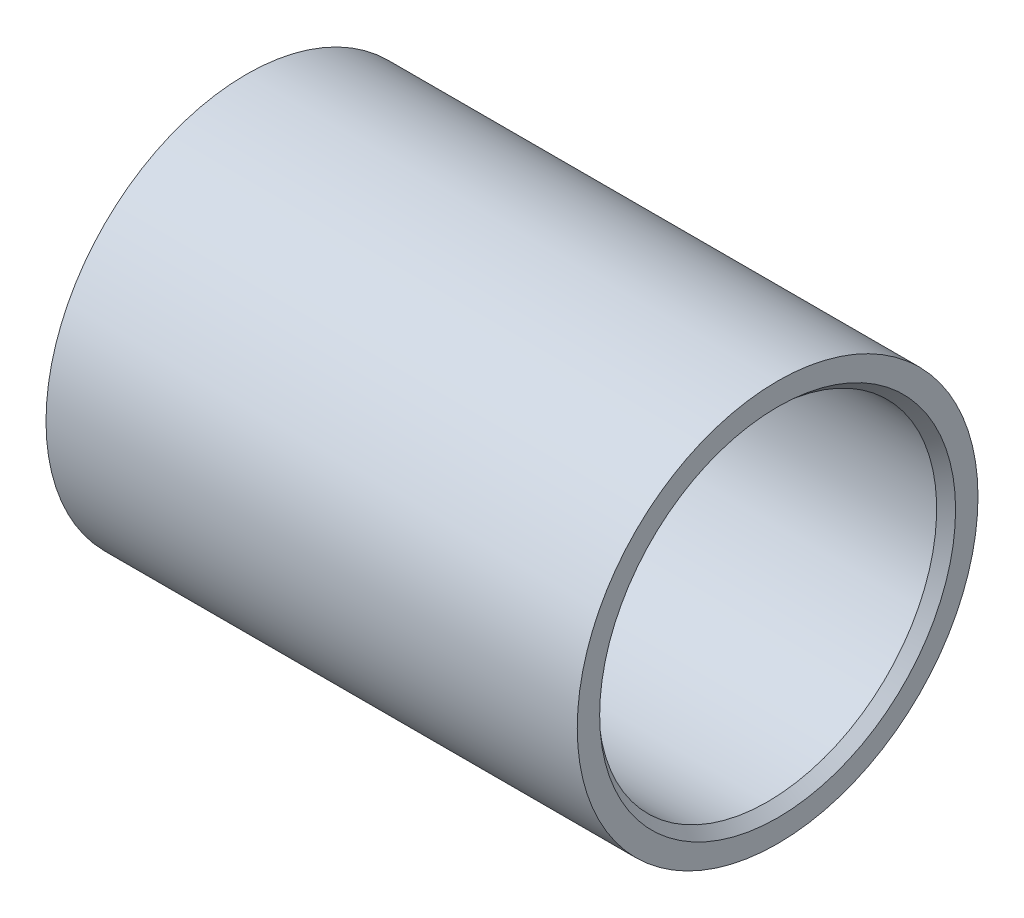
ISO-10303-21;
HEADER;
FILE_DESCRIPTION(('STEP AP214'),'2;1');
FILE_NAME('part.step','',(''),(''),'','','');
FILE_SCHEMA(('AUTOMOTIVE_DESIGN { 1 0 10303 214 1 1 1 1 }'));
ENDSEC;
DATA;
#1=APPLICATION_CONTEXT('core data for automotive mechanical design processes');
#2=APPLICATION_PROTOCOL_DEFINITION('international standard','automotive_design',2000,#1);
#3=PRODUCT_CONTEXT('',#1,'mechanical');
#4=PRODUCT('Part','Part','',(#3));
#5=PRODUCT_RELATED_PRODUCT_CATEGORY('part','',(#4));
#6=PRODUCT_DEFINITION_FORMATION('','',#4);
#7=PRODUCT_DEFINITION_CONTEXT('part definition',#1,'design');
#8=PRODUCT_DEFINITION('design','',#6,#7);
#9=PRODUCT_DEFINITION_SHAPE('','',#8);
#10=(LENGTH_UNIT() NAMED_UNIT(*) SI_UNIT(.MILLI.,.METRE.));
#11=(NAMED_UNIT(*) PLANE_ANGLE_UNIT() SI_UNIT($,.RADIAN.));
#12=(NAMED_UNIT(*) SI_UNIT($,.STERADIAN.) SOLID_ANGLE_UNIT());
#13=UNCERTAINTY_MEASURE_WITH_UNIT(LENGTH_MEASURE(1.E-05),#10,'distance_accuracy_value','');
#14=(GEOMETRIC_REPRESENTATION_CONTEXT(3) GLOBAL_UNCERTAINTY_ASSIGNED_CONTEXT((#13)) GLOBAL_UNIT_ASSIGNED_CONTEXT((#10,
#11,#12)) REPRESENTATION_CONTEXT('',''));
#15=CARTESIAN_POINT('',(0.,0.,0.));
#16=DIRECTION('',(0.,0.,1.));
#17=DIRECTION('',(1.,0.,0.));
#18=AXIS2_PLACEMENT_3D('',#15,#16,#17);
#19=CARTESIAN_POINT('',(-18.6685426629162,15.0876,0.));
#20=DIRECTION('',(-1.,0.,0.));
#21=DIRECTION('',(0.,-1.,0.));
#22=AXIS2_PLACEMENT_3D('',#19,#20,#21);
#23=PLANE('',#22);
#24=CARTESIAN_POINT('',(-18.6685426629161,0.,0.));
#25=DIRECTION('',(1.,0.,0.));
#26=DIRECTION('',(0.,1.,0.));
#27=AXIS2_PLACEMENT_3D('',#24,#25,#26);
#28=CIRCLE('',#27,13.5026853221025);
#29=CARTESIAN_POINT('',(-18.6685426629161,13.5026853221025,0.));
#30=VERTEX_POINT('',#29);
#31=EDGE_CURVE('E10',#30,#30,#28,.T.);
#32=ORIENTED_EDGE('',*,*,#31,.T.);
#33=EDGE_LOOP('',(#32));
#34=FACE_BOUND('',#33,.T.);
#35=CARTESIAN_POINT('',(-18.6685426629162,0.,0.));
#36=DIRECTION('',(1.,0.,0.));
#37=DIRECTION('',(0.,1.,0.));
#38=AXIS2_PLACEMENT_3D('',#35,#36,#37);
#39=CIRCLE('',#38,15.0876);
#40=CARTESIAN_POINT('',(-18.6685426629162,15.0876,0.));
#41=VERTEX_POINT('',#40);
#42=EDGE_CURVE('E70',#41,#41,#39,.T.);
#43=ORIENTED_EDGE('',*,*,#42,.F.);
#44=EDGE_LOOP('',(#43));
#45=FACE_BOUND('',#44,.T.);
#46=ADVANCED_FACE('F43',(#34,#45),#23,.T.);
#47=CARTESIAN_POINT('',(-18.6685426629161,0.,0.));
#48=DIRECTION('',(-1.,0.,0.));
#49=DIRECTION('',(0.,-1.,0.));
#50=AXIS2_PLACEMENT_3D('',#47,#48,#49);
#51=CONICAL_SURFACE('',#50,13.5026853221025,0.785398163397605);
#52=CARTESIAN_POINT('',(-17.9039573408138,0.,0.));
#53=DIRECTION('',(1.,0.,0.));
#54=DIRECTION('',(0.,1.,0.));
#55=AXIS2_PLACEMENT_3D('',#52,#53,#54);
#56=CIRCLE('',#55,12.7381);
#57=CARTESIAN_POINT('',(-17.9039573408138,12.7381,0.));
#58=VERTEX_POINT('',#57);
#59=EDGE_CURVE('E50',#58,#58,#56,.T.);
#60=ORIENTED_EDGE('',*,*,#59,.T.);
#61=EDGE_LOOP('',(#60));
#62=FACE_BOUND('',#61,.T.);
#63=ORIENTED_EDGE('',*,*,#31,.F.);
#64=EDGE_LOOP('',(#63));
#65=FACE_BOUND('',#64,.T.);
#66=ADVANCED_FACE('F79',(#62,#65),#51,.F.);
#67=CARTESIAN_POINT('',(-18.6685426629162,0.,0.));
#68=DIRECTION('',(1.,0.,0.));
#69=DIRECTION('',(0.,1.,0.));
#70=AXIS2_PLACEMENT_3D('',#67,#68,#69);
#71=CYLINDRICAL_SURFACE('',#70,12.7381);
#72=CARTESIAN_POINT('',(20.5694573370838,0.,0.));
#73=DIRECTION('',(1.,0.,0.));
#74=DIRECTION('',(0.,1.,0.));
#75=AXIS2_PLACEMENT_3D('',#72,#73,#74);
#76=CIRCLE('',#75,12.7381);
#77=CARTESIAN_POINT('',(20.5694573370838,12.7381,0.));
#78=VERTEX_POINT('',#77);
#79=EDGE_CURVE('E55',#78,#78,#76,.T.);
#80=ORIENTED_EDGE('',*,*,#79,.T.);
#81=EDGE_LOOP('',(#80));
#82=FACE_BOUND('',#81,.T.);
#83=ORIENTED_EDGE('',*,*,#59,.F.);
#84=EDGE_LOOP('',(#83));
#85=FACE_BOUND('',#84,.T.);
#86=ADVANCED_FACE('F83',(#82,#85),#71,.F.);
#87=CARTESIAN_POINT('',(20.5694573370838,0.,0.));
#88=DIRECTION('',(1.,0.,0.));
#89=DIRECTION('',(0.,1.,0.));
#90=AXIS2_PLACEMENT_3D('',#87,#88,#89);
#91=CONICAL_SURFACE('',#90,12.7381,0.714742753024015);
#92=CARTESIAN_POINT('',(21.3314573370838,0.,0.));
#93=DIRECTION('',(1.,0.,0.));
#94=DIRECTION('',(0.,1.,0.));
#95=AXIS2_PLACEMENT_3D('',#92,#93,#94);
#96=CIRCLE('',#95,13.3993705587191);
#97=CARTESIAN_POINT('',(21.3314573370838,13.3993705587191,0.));
#98=VERTEX_POINT('',#97);
#99=EDGE_CURVE('E60',#98,#98,#96,.T.);
#100=ORIENTED_EDGE('',*,*,#99,.T.);
#101=EDGE_LOOP('',(#100));
#102=FACE_BOUND('',#101,.T.);
#103=ORIENTED_EDGE('',*,*,#79,.F.);
#104=EDGE_LOOP('',(#103));
#105=FACE_BOUND('',#104,.T.);
#106=ADVANCED_FACE('F87',(#102,#105),#91,.F.);
#107=CARTESIAN_POINT('',(21.3314573370838,13.3993705587191,0.));
#108=DIRECTION('',(1.,0.,0.));
#109=DIRECTION('',(0.,1.,0.));
#110=AXIS2_PLACEMENT_3D('',#107,#108,#109);
#111=PLANE('',#110);
#112=CARTESIAN_POINT('',(21.3314573370838,0.,0.));
#113=DIRECTION('',(1.,0.,0.));
#114=DIRECTION('',(0.,1.,0.));
#115=AXIS2_PLACEMENT_3D('',#112,#113,#114);
#116=CIRCLE('',#115,15.0876);
#117=CARTESIAN_POINT('',(21.3314573370838,15.0876,0.));
#118=VERTEX_POINT('',#117);
#119=EDGE_CURVE('E66',#118,#118,#116,.T.);
#120=ORIENTED_EDGE('',*,*,#119,.T.);
#121=EDGE_LOOP('',(#120));
#122=FACE_BOUND('',#121,.T.);
#123=ORIENTED_EDGE('',*,*,#99,.F.);
#124=EDGE_LOOP('',(#123));
#125=FACE_BOUND('',#124,.T.);
#126=ADVANCED_FACE('F94',(#122,#125),#111,.T.);
#127=CARTESIAN_POINT('',(-18.6685426629162,0.,0.));
#128=DIRECTION('',(1.,0.,0.));
#129=DIRECTION('',(0.,1.,0.));
#130=AXIS2_PLACEMENT_3D('',#127,#128,#129);
#131=CYLINDRICAL_SURFACE('',#130,15.0876);
#132=ORIENTED_EDGE('',*,*,#42,.T.);
#133=EDGE_LOOP('',(#132));
#134=FACE_BOUND('',#133,.T.);
#135=ORIENTED_EDGE('',*,*,#119,.F.);
#136=EDGE_LOOP('',(#135));
#137=FACE_BOUND('',#136,.T.);
#138=ADVANCED_FACE('F75',(#134,#137),#131,.T.);
#139=CLOSED_SHELL('',(#46,#66,#86,#106,#126,#138));
#140=MANIFOLD_SOLID_BREP('B2',#139);
#141=ADVANCED_BREP_SHAPE_REPRESENTATION('',(#18,#140),#14);
#142=SHAPE_DEFINITION_REPRESENTATION(#9,#141);
ENDSEC;
END-ISO-10303-21;
